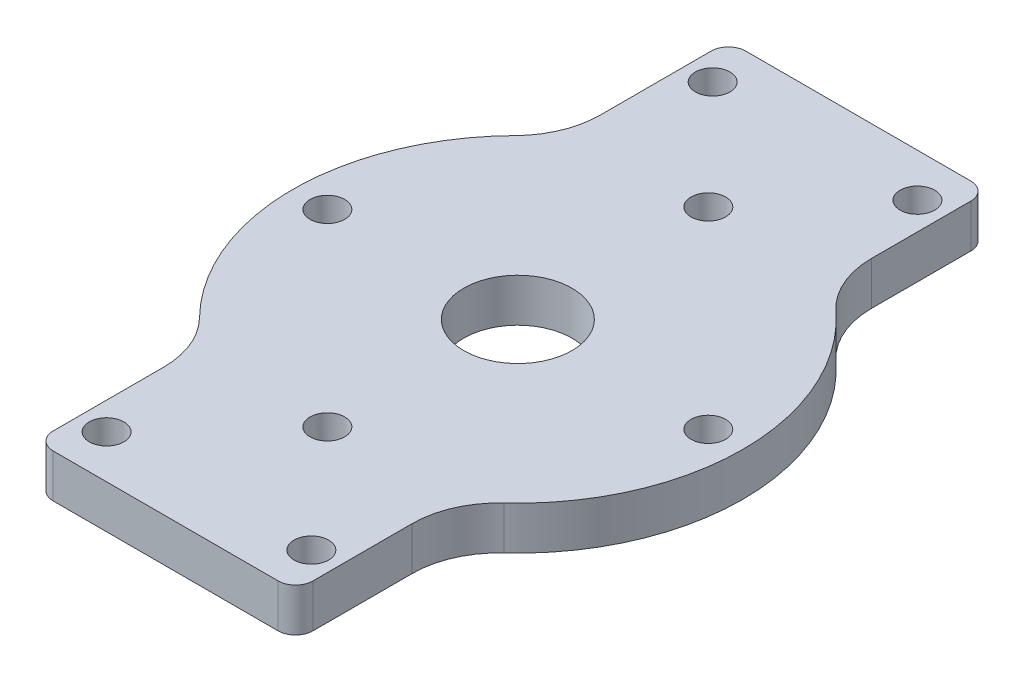
ISO-10303-21;
HEADER;
FILE_DESCRIPTION(('STEP AP214'),'2;1');
FILE_NAME('part.step','',(''),(''),'','','');
FILE_SCHEMA(('AUTOMOTIVE_DESIGN { 1 0 10303 214 1 1 1 1 }'));
ENDSEC;
DATA;
#1=APPLICATION_CONTEXT('core data for automotive mechanical design processes');
#2=APPLICATION_PROTOCOL_DEFINITION('international standard','automotive_design',2000,#1);
#3=PRODUCT_CONTEXT('',#1,'mechanical');
#4=PRODUCT('Part','Part','',(#3));
#5=PRODUCT_RELATED_PRODUCT_CATEGORY('part','',(#4));
#6=PRODUCT_DEFINITION_FORMATION('','',#4);
#7=PRODUCT_DEFINITION_CONTEXT('part definition',#1,'design');
#8=PRODUCT_DEFINITION('design','',#6,#7);
#9=PRODUCT_DEFINITION_SHAPE('','',#8);
#10=(LENGTH_UNIT() NAMED_UNIT(*) SI_UNIT(.MILLI.,.METRE.));
#11=(NAMED_UNIT(*) PLANE_ANGLE_UNIT() SI_UNIT($,.RADIAN.));
#12=(NAMED_UNIT(*) SI_UNIT($,.STERADIAN.) SOLID_ANGLE_UNIT());
#13=UNCERTAINTY_MEASURE_WITH_UNIT(LENGTH_MEASURE(1.E-05),#10,'distance_accuracy_value','');
#14=(GEOMETRIC_REPRESENTATION_CONTEXT(3) GLOBAL_UNCERTAINTY_ASSIGNED_CONTEXT((#13)) GLOBAL_UNIT_ASSIGNED_CONTEXT((#10,
#11,#12)) REPRESENTATION_CONTEXT('',''));
#15=CARTESIAN_POINT('',(0.,0.,0.));
#16=DIRECTION('',(0.,0.,1.));
#17=DIRECTION('',(1.,0.,0.));
#18=AXIS2_PLACEMENT_3D('',#15,#16,#17);
#19=CARTESIAN_POINT('',(-25.6756756756757,2.5,25.2340975387969));
#20=DIRECTION('',(0.,-1.,0.));
#21=DIRECTION('',(0.,0.,-1.));
#22=AXIS2_PLACEMENT_3D('',#19,#20,#21);
#23=CYLINDRICAL_SURFACE('',#22,10.);
#24=CARTESIAN_POINT('',(-25.6756756756757,-2.5,25.2340975387969));
#25=DIRECTION('',(0.,-1.,0.));
#26=DIRECTION('',(0.,0.,1.));
#27=AXIS2_PLACEMENT_3D('',#24,#25,#26);
#28=CIRCLE('',#27,10.);
#29=CARTESIAN_POINT('',(-18.5435435435435,-2.5,18.2246260002422));
#30=VERTEX_POINT('',#29);
#31=CARTESIAN_POINT('',(-15.6756756756757,-2.5,25.2340975387969));
#32=VERTEX_POINT('',#31);
#33=EDGE_CURVE('E181',#30,#32,#28,.T.);
#34=ORIENTED_EDGE('',*,*,#33,.T.);
#35=DIRECTION('',(0.,-1.,0.));
#36=VECTOR('',#35,1.);
#37=CARTESIAN_POINT('',(-15.6756756756757,2.5,25.2340975387969));
#38=LINE('',#37,#36);
#39=CARTESIAN_POINT('',(-15.6756756756757,2.5,25.2340975387969));
#40=VERTEX_POINT('',#39);
#41=EDGE_CURVE('E161',#40,#32,#38,.T.);
#42=ORIENTED_EDGE('',*,*,#41,.F.);
#43=CARTESIAN_POINT('',(-25.6756756756757,2.5,25.2340975387969));
#44=DIRECTION('',(0.,-1.,0.));
#45=DIRECTION('',(0.,0.,1.));
#46=AXIS2_PLACEMENT_3D('',#43,#44,#45);
#47=CIRCLE('',#46,10.);
#48=CARTESIAN_POINT('',(-18.5435435435435,2.5,18.2246260002422));
#49=VERTEX_POINT('',#48);
#50=EDGE_CURVE('E167',#49,#40,#47,.T.);
#51=ORIENTED_EDGE('',*,*,#50,.F.);
#52=DIRECTION('',(0.,-1.,0.));
#53=VECTOR('',#52,1.);
#54=CARTESIAN_POINT('',(-18.5435435435435,2.5,18.2246260002422));
#55=LINE('',#54,#53);
#56=EDGE_CURVE('E334',#49,#30,#55,.T.);
#57=ORIENTED_EDGE('',*,*,#56,.T.);
#58=EDGE_LOOP('',(#34,#42,#51,#57));
#59=FACE_BOUND('',#58,.T.);
#60=ADVANCED_FACE('F41',(#59),#23,.F.);
#61=CARTESIAN_POINT('',(-15.6756756756757,2.5,25.2340975387969));
#62=DIRECTION('',(1.,0.,0.));
#63=DIRECTION('',(0.,0.,-1.));
#64=AXIS2_PLACEMENT_3D('',#61,#62,#63);
#65=PLANE('',#64);
#66=DIRECTION('',(0.,0.,1.));
#67=VECTOR('',#66,1.);
#68=CARTESIAN_POINT('',(-15.6756756756757,-2.5,25.2340975387969));
#69=LINE('',#68,#67);
#70=CARTESIAN_POINT('',(-15.6756756756757,-2.5,38.));
#71=VERTEX_POINT('',#70);
#72=EDGE_CURVE('E309',#32,#71,#69,.T.);
#73=ORIENTED_EDGE('',*,*,#72,.T.);
#74=DIRECTION('',(0.,-1.,0.));
#75=VECTOR('',#74,1.);
#76=CARTESIAN_POINT('',(-15.6756756756757,2.5,38.));
#77=LINE('',#76,#75);
#78=CARTESIAN_POINT('',(-15.6756756756757,2.5,38.));
#79=VERTEX_POINT('',#78);
#80=EDGE_CURVE('E50',#71,#79,#77,.F.);
#81=ORIENTED_EDGE('',*,*,#80,.T.);
#82=DIRECTION('',(0.,0.,1.));
#83=VECTOR('',#82,1.);
#84=CARTESIAN_POINT('',(-15.6756756756757,2.5,25.2340975387969));
#85=LINE('',#84,#83);
#86=EDGE_CURVE('E156',#40,#79,#85,.T.);
#87=ORIENTED_EDGE('',*,*,#86,.F.);
#88=ORIENTED_EDGE('',*,*,#41,.T.);
#89=EDGE_LOOP('',(#73,#81,#87,#88));
#90=FACE_BOUND('',#89,.T.);
#91=ADVANCED_FACE('F159',(#90),#65,.F.);
#92=CARTESIAN_POINT('',(-15.6756756756757,2.5,40.));
#93=DIRECTION('',(0.,0.,-1.));
#94=DIRECTION('',(-1.,0.,0.));
#95=AXIS2_PLACEMENT_3D('',#92,#93,#94);
#96=PLANE('',#95);
#97=DIRECTION('',(1.,0.,0.));
#98=VECTOR('',#97,1.);
#99=CARTESIAN_POINT('',(-15.6756756756757,-2.5,40.));
#100=LINE('',#99,#98);
#101=CARTESIAN_POINT('',(-13.6756756756757,-2.5,40.));
#102=VERTEX_POINT('',#101);
#103=CARTESIAN_POINT('',(12.3243243243243,-2.5,40.));
#104=VERTEX_POINT('',#103);
#105=EDGE_CURVE('E285',#102,#104,#100,.T.);
#106=ORIENTED_EDGE('',*,*,#105,.T.);
#107=DIRECTION('',(0.,-1.,0.));
#108=VECTOR('',#107,1.);
#109=CARTESIAN_POINT('',(12.3243243243243,2.5,40.));
#110=LINE('',#109,#108);
#111=CARTESIAN_POINT('',(12.3243243243243,2.5,40.));
#112=VERTEX_POINT('',#111);
#113=EDGE_CURVE('E275',#104,#112,#110,.F.);
#114=ORIENTED_EDGE('',*,*,#113,.T.);
#115=DIRECTION('',(1.,0.,0.));
#116=VECTOR('',#115,1.);
#117=CARTESIAN_POINT('',(-15.6756756756757,2.5,40.));
#118=LINE('',#117,#116);
#119=CARTESIAN_POINT('',(-13.6756756756757,2.5,40.));
#120=VERTEX_POINT('',#119);
#121=EDGE_CURVE('E166',#120,#112,#118,.T.);
#122=ORIENTED_EDGE('',*,*,#121,.F.);
#123=DIRECTION('',(0.,-1.,0.));
#124=VECTOR('',#123,1.);
#125=CARTESIAN_POINT('',(-13.6756756756757,2.5,40.));
#126=LINE('',#125,#124);
#127=EDGE_CURVE('E271',#120,#102,#126,.T.);
#128=ORIENTED_EDGE('',*,*,#127,.T.);
#129=EDGE_LOOP('',(#106,#114,#122,#128));
#130=FACE_BOUND('',#129,.T.);
#131=ADVANCED_FACE('F282',(#130),#96,.F.);
#132=CARTESIAN_POINT('',(14.3243243243243,2.5,26.5391643833238));
#133=DIRECTION('',(-1.,0.,0.));
#134=DIRECTION('',(0.,0.,1.));
#135=AXIS2_PLACEMENT_3D('',#132,#133,#134);
#136=PLANE('',#135);
#137=DIRECTION('',(0.,0.,-1.));
#138=VECTOR('',#137,1.);
#139=CARTESIAN_POINT('',(14.3243243243243,2.5,26.5391643833238));
#140=LINE('',#139,#138);
#141=CARTESIAN_POINT('',(14.3243243243243,2.5,38.));
#142=VERTEX_POINT('',#141);
#143=CARTESIAN_POINT('',(14.3243243243243,2.5,26.5391643833238));
#144=VERTEX_POINT('',#143);
#145=EDGE_CURVE('E288',#142,#144,#140,.T.);
#146=ORIENTED_EDGE('',*,*,#145,.F.);
#147=DIRECTION('',(0.,-1.,0.));
#148=VECTOR('',#147,1.);
#149=CARTESIAN_POINT('',(14.3243243243243,2.5,38.));
#150=LINE('',#149,#148);
#151=CARTESIAN_POINT('',(14.3243243243243,-2.5,38.));
#152=VERTEX_POINT('',#151);
#153=EDGE_CURVE('E267',#142,#152,#150,.T.);
#154=ORIENTED_EDGE('',*,*,#153,.T.);
#155=DIRECTION('',(0.,0.,-1.));
#156=VECTOR('',#155,1.);
#157=CARTESIAN_POINT('',(14.3243243243243,-2.5,26.5391643833238));
#158=LINE('',#157,#156);
#159=CARTESIAN_POINT('',(14.3243243243243,-2.5,26.5391643833238));
#160=VERTEX_POINT('',#159);
#161=EDGE_CURVE('E296',#152,#160,#158,.T.);
#162=ORIENTED_EDGE('',*,*,#161,.T.);
#163=DIRECTION('',(0.,-1.,0.));
#164=VECTOR('',#163,1.);
#165=CARTESIAN_POINT('',(14.3243243243243,2.5,26.5391643833238));
#166=LINE('',#165,#164);
#167=EDGE_CURVE('E184',#144,#160,#166,.T.);
#168=ORIENTED_EDGE('',*,*,#167,.F.);
#169=EDGE_LOOP('',(#146,#154,#162,#168));
#170=FACE_BOUND('',#169,.T.);
#171=ADVANCED_FACE('F294',(#170),#136,.F.);
#172=CARTESIAN_POINT('',(24.3243243243243,2.5,26.5391643833238));
#173=DIRECTION('',(0.,-1.,0.));
#174=DIRECTION('',(0.,0.,-1.));
#175=AXIS2_PLACEMENT_3D('',#172,#173,#174);
#176=CYLINDRICAL_SURFACE('',#175,10.);
#177=CARTESIAN_POINT('',(24.3243243243243,-2.5,26.5391643833238));
#178=DIRECTION('',(0.,-1.,0.));
#179=DIRECTION('',(0.,0.,-1.));
#180=AXIS2_PLACEMENT_3D('',#177,#178,#179);
#181=CIRCLE('',#180,10.);
#182=CARTESIAN_POINT('',(17.5675675675676,-2.5,19.167174276845));
#183=VERTEX_POINT('',#182);
#184=EDGE_CURVE('E302',#160,#183,#181,.T.);
#185=ORIENTED_EDGE('',*,*,#184,.T.);
#186=DIRECTION('',(0.,-1.,0.));
#187=VECTOR('',#186,1.);
#188=CARTESIAN_POINT('',(17.5675675675676,2.5,19.167174276845));
#189=LINE('',#188,#187);
#190=CARTESIAN_POINT('',(17.5675675675676,2.5,19.167174276845));
#191=VERTEX_POINT('',#190);
#192=EDGE_CURVE('E191',#191,#183,#189,.T.);
#193=ORIENTED_EDGE('',*,*,#192,.F.);
#194=CARTESIAN_POINT('',(24.3243243243243,2.5,26.5391643833238));
#195=DIRECTION('',(0.,-1.,0.));
#196=DIRECTION('',(0.,0.,-1.));
#197=AXIS2_PLACEMENT_3D('',#194,#195,#196);
#198=CIRCLE('',#197,10.);
#199=EDGE_CURVE('E711',#144,#191,#198,.T.);
#200=ORIENTED_EDGE('',*,*,#199,.F.);
#201=ORIENTED_EDGE('',*,*,#167,.T.);
#202=EDGE_LOOP('',(#185,#193,#200,#201));
#203=FACE_BOUND('',#202,.T.);
#204=ADVANCED_FACE('F460',(#203),#176,.F.);
#205=CARTESIAN_POINT('',(0.,2.5,0.));
#206=DIRECTION('',(0.,-1.,0.));
#207=DIRECTION('',(0.,0.,-1.));
#208=AXIS2_PLACEMENT_3D('',#205,#206,#207);
#209=CYLINDRICAL_SURFACE('',#208,26.);
#210=CARTESIAN_POINT('',(0.,-2.5,0.));
#211=DIRECTION('',(0.,1.,0.));
#212=DIRECTION('',(0.,0.,1.));
#213=AXIS2_PLACEMENT_3D('',#210,#211,#212);
#214=CIRCLE('',#213,26.);
#215=CARTESIAN_POINT('',(17.5675675675676,-2.5,-19.167174276845));
#216=VERTEX_POINT('',#215);
#217=EDGE_CURVE('E307',#183,#216,#214,.T.);
#218=ORIENTED_EDGE('',*,*,#217,.T.);
#219=DIRECTION('',(0.,-1.,0.));
#220=VECTOR('',#219,1.);
#221=CARTESIAN_POINT('',(17.5675675675676,2.5,-19.167174276845));
#222=LINE('',#221,#220);
#223=CARTESIAN_POINT('',(17.5675675675676,2.5,-19.167174276845));
#224=VERTEX_POINT('',#223);
#225=EDGE_CURVE('E349',#224,#216,#222,.T.);
#226=ORIENTED_EDGE('',*,*,#225,.F.);
#227=CARTESIAN_POINT('',(0.,2.5,0.));
#228=DIRECTION('',(0.,1.,0.));
#229=DIRECTION('',(0.,0.,1.));
#230=AXIS2_PLACEMENT_3D('',#227,#228,#229);
#231=CIRCLE('',#230,26.);
#232=EDGE_CURVE('E359',#191,#224,#231,.T.);
#233=ORIENTED_EDGE('',*,*,#232,.F.);
#234=ORIENTED_EDGE('',*,*,#192,.T.);
#235=EDGE_LOOP('',(#218,#226,#233,#234));
#236=FACE_BOUND('',#235,.T.);
#237=ADVANCED_FACE('F357',(#236),#209,.T.);
#238=CARTESIAN_POINT('',(24.3243243243243,2.5,-26.5391643833238));
#239=DIRECTION('',(0.,-1.,0.));
#240=DIRECTION('',(0.,0.,-1.));
#241=AXIS2_PLACEMENT_3D('',#238,#239,#240);
#242=CYLINDRICAL_SURFACE('',#241,10.);
#243=CARTESIAN_POINT('',(24.3243243243243,-2.5,-26.5391643833238));
#244=DIRECTION('',(0.,-1.,0.));
#245=DIRECTION('',(0.,0.,1.));
#246=AXIS2_PLACEMENT_3D('',#243,#244,#245);
#247=CIRCLE('',#246,10.);
#248=CARTESIAN_POINT('',(14.3243243243243,-2.5,-26.5391643833238));
#249=VERTEX_POINT('',#248);
#250=EDGE_CURVE('E315',#216,#249,#247,.T.);
#251=ORIENTED_EDGE('',*,*,#250,.T.);
#252=DIRECTION('',(0.,-1.,0.));
#253=VECTOR('',#252,1.);
#254=CARTESIAN_POINT('',(14.3243243243243,2.5,-26.5391643833238));
#255=LINE('',#254,#253);
#256=CARTESIAN_POINT('',(14.3243243243243,2.5,-26.5391643833238));
#257=VERTEX_POINT('',#256);
#258=EDGE_CURVE('E345',#257,#249,#255,.T.);
#259=ORIENTED_EDGE('',*,*,#258,.F.);
#260=CARTESIAN_POINT('',(24.3243243243243,2.5,-26.5391643833238));
#261=DIRECTION('',(0.,-1.,0.));
#262=DIRECTION('',(0.,0.,1.));
#263=AXIS2_PLACEMENT_3D('',#260,#261,#262);
#264=CIRCLE('',#263,10.);
#265=EDGE_CURVE('E376',#224,#257,#264,.T.);
#266=ORIENTED_EDGE('',*,*,#265,.F.);
#267=ORIENTED_EDGE('',*,*,#225,.T.);
#268=EDGE_LOOP('',(#251,#259,#266,#267));
#269=FACE_BOUND('',#268,.T.);
#270=ADVANCED_FACE('F366',(#269),#242,.F.);
#271=CARTESIAN_POINT('',(14.3243243243243,2.5,-40.));
#272=DIRECTION('',(-1.,0.,0.));
#273=DIRECTION('',(0.,0.,1.));
#274=AXIS2_PLACEMENT_3D('',#271,#272,#273);
#275=PLANE('',#274);
#276=DIRECTION('',(0.,0.,-1.));
#277=VECTOR('',#276,1.);
#278=CARTESIAN_POINT('',(14.3243243243243,-2.5,-40.));
#279=LINE('',#278,#277);
#280=CARTESIAN_POINT('',(14.3243243243243,-2.5,-38.));
#281=VERTEX_POINT('',#280);
#282=EDGE_CURVE('E318',#249,#281,#279,.T.);
#283=ORIENTED_EDGE('',*,*,#282,.T.);
#284=DIRECTION('',(0.,-1.,0.));
#285=VECTOR('',#284,1.);
#286=CARTESIAN_POINT('',(14.3243243243243,2.5,-38.));
#287=LINE('',#286,#285);
#288=CARTESIAN_POINT('',(14.3243243243243,2.5,-38.));
#289=VERTEX_POINT('',#288);
#290=EDGE_CURVE('E254',#281,#289,#287,.F.);
#291=ORIENTED_EDGE('',*,*,#290,.T.);
#292=DIRECTION('',(0.,0.,-1.));
#293=VECTOR('',#292,1.);
#294=CARTESIAN_POINT('',(14.3243243243243,2.5,-40.));
#295=LINE('',#294,#293);
#296=EDGE_CURVE('E372',#257,#289,#295,.T.);
#297=ORIENTED_EDGE('',*,*,#296,.F.);
#298=ORIENTED_EDGE('',*,*,#258,.T.);
#299=EDGE_LOOP('',(#283,#291,#297,#298));
#300=FACE_BOUND('',#299,.T.);
#301=ADVANCED_FACE('F370',(#300),#275,.F.);
#302=CARTESIAN_POINT('',(-15.6756756756757,2.5,-40.));
#303=DIRECTION('',(0.,0.,1.));
#304=DIRECTION('',(1.,0.,0.));
#305=AXIS2_PLACEMENT_3D('',#302,#303,#304);
#306=PLANE('',#305);
#307=DIRECTION('',(-1.,0.,0.));
#308=VECTOR('',#307,1.);
#309=CARTESIAN_POINT('',(-15.6756756756757,2.5,-40.));
#310=LINE('',#309,#308);
#311=CARTESIAN_POINT('',(12.3243243243243,2.5,-40.));
#312=VERTEX_POINT('',#311);
#313=CARTESIAN_POINT('',(-13.6756756756757,2.5,-40.));
#314=VERTEX_POINT('',#313);
#315=EDGE_CURVE('E375',#312,#314,#310,.T.);
#316=ORIENTED_EDGE('',*,*,#315,.F.);
#317=DIRECTION('',(0.,-1.,0.));
#318=VECTOR('',#317,1.);
#319=CARTESIAN_POINT('',(12.3243243243243,2.5,-40.));
#320=LINE('',#319,#318);
#321=CARTESIAN_POINT('',(12.3243243243243,-2.5,-40.));
#322=VERTEX_POINT('',#321);
#323=EDGE_CURVE('E188',#312,#322,#320,.T.);
#324=ORIENTED_EDGE('',*,*,#323,.T.);
#325=DIRECTION('',(-1.,0.,0.));
#326=VECTOR('',#325,1.);
#327=CARTESIAN_POINT('',(-15.6756756756757,-2.5,-40.));
#328=LINE('',#327,#326);
#329=CARTESIAN_POINT('',(-13.6756756756757,-2.5,-40.));
#330=VERTEX_POINT('',#329);
#331=EDGE_CURVE('E322',#322,#330,#328,.T.);
#332=ORIENTED_EDGE('',*,*,#331,.T.);
#333=DIRECTION('',(0.,-1.,0.));
#334=VECTOR('',#333,1.);
#335=CARTESIAN_POINT('',(-13.6756756756757,2.5,-40.));
#336=LINE('',#335,#334);
#337=EDGE_CURVE('E183',#330,#314,#336,.F.);
#338=ORIENTED_EDGE('',*,*,#337,.T.);
#339=EDGE_LOOP('',(#316,#324,#332,#338));
#340=FACE_BOUND('',#339,.T.);
#341=ADVANCED_FACE('F424',(#340),#306,.F.);
#342=CARTESIAN_POINT('',(-15.6756756756757,2.5,-40.));
#343=DIRECTION('',(1.,0.,0.));
#344=DIRECTION('',(0.,0.,-1.));
#345=AXIS2_PLACEMENT_3D('',#342,#343,#344);
#346=PLANE('',#345);
#347=DIRECTION('',(0.,0.,1.));
#348=VECTOR('',#347,1.);
#349=CARTESIAN_POINT('',(-15.6756756756757,2.5,-40.));
#350=LINE('',#349,#348);
#351=CARTESIAN_POINT('',(-15.6756756756757,2.5,-38.));
#352=VERTEX_POINT('',#351);
#353=CARTESIAN_POINT('',(-15.6756756756757,2.5,-25.2340975387969));
#354=VERTEX_POINT('',#353);
#355=EDGE_CURVE('E380',#352,#354,#350,.T.);
#356=ORIENTED_EDGE('',*,*,#355,.F.);
#357=DIRECTION('',(0.,-1.,0.));
#358=VECTOR('',#357,1.);
#359=CARTESIAN_POINT('',(-15.6756756756757,2.5,-38.));
#360=LINE('',#359,#358);
#361=CARTESIAN_POINT('',(-15.6756756756757,-2.5,-38.));
#362=VERTEX_POINT('',#361);
#363=EDGE_CURVE('E11',#352,#362,#360,.T.);
#364=ORIENTED_EDGE('',*,*,#363,.T.);
#365=DIRECTION('',(0.,0.,1.));
#366=VECTOR('',#365,1.);
#367=CARTESIAN_POINT('',(-15.6756756756757,-2.5,-40.));
#368=LINE('',#367,#366);
#369=CARTESIAN_POINT('',(-15.6756756756757,-2.5,-25.2340975387969));
#370=VERTEX_POINT('',#369);
#371=EDGE_CURVE('E326',#362,#370,#368,.T.);
#372=ORIENTED_EDGE('',*,*,#371,.T.);
#373=DIRECTION('',(0.,-1.,0.));
#374=VECTOR('',#373,1.);
#375=CARTESIAN_POINT('',(-15.6756756756757,2.5,-25.2340975387969));
#376=LINE('',#375,#374);
#377=EDGE_CURVE('E341',#354,#370,#376,.T.);
#378=ORIENTED_EDGE('',*,*,#377,.F.);
#379=EDGE_LOOP('',(#356,#364,#372,#378));
#380=FACE_BOUND('',#379,.T.);
#381=ADVANCED_FACE('F429',(#380),#346,.F.);
#382=CARTESIAN_POINT('',(-25.6756756756757,2.5,-25.2340975387969));
#383=DIRECTION('',(0.,-1.,0.));
#384=DIRECTION('',(0.,0.,-1.));
#385=AXIS2_PLACEMENT_3D('',#382,#383,#384);
#386=CYLINDRICAL_SURFACE('',#385,10.);
#387=CARTESIAN_POINT('',(-25.6756756756757,-2.5,-25.2340975387969));
#388=DIRECTION('',(0.,-1.,0.));
#389=DIRECTION('',(0.,0.,-1.));
#390=AXIS2_PLACEMENT_3D('',#387,#388,#389);
#391=CIRCLE('',#390,10.);
#392=CARTESIAN_POINT('',(-18.5435435435435,-2.5,-18.2246260002422));
#393=VERTEX_POINT('',#392);
#394=EDGE_CURVE('E329',#370,#393,#391,.T.);
#395=ORIENTED_EDGE('',*,*,#394,.T.);
#396=DIRECTION('',(0.,-1.,0.));
#397=VECTOR('',#396,1.);
#398=CARTESIAN_POINT('',(-18.5435435435435,2.5,-18.2246260002422));
#399=LINE('',#398,#397);
#400=CARTESIAN_POINT('',(-18.5435435435435,2.5,-18.2246260002422));
#401=VERTEX_POINT('',#400);
#402=EDGE_CURVE('E337',#401,#393,#399,.T.);
#403=ORIENTED_EDGE('',*,*,#402,.F.);
#404=CARTESIAN_POINT('',(-25.6756756756757,2.5,-25.2340975387969));
#405=DIRECTION('',(0.,-1.,0.));
#406=DIRECTION('',(0.,0.,-1.));
#407=AXIS2_PLACEMENT_3D('',#404,#405,#406);
#408=CIRCLE('',#407,10.);
#409=EDGE_CURVE('E387',#354,#401,#408,.T.);
#410=ORIENTED_EDGE('',*,*,#409,.F.);
#411=ORIENTED_EDGE('',*,*,#377,.T.);
#412=EDGE_LOOP('',(#395,#403,#410,#411));
#413=FACE_BOUND('',#412,.T.);
#414=ADVANCED_FACE('F435',(#413),#386,.F.);
#415=CARTESIAN_POINT('',(0.,2.5,0.));
#416=DIRECTION('',(0.,-1.,0.));
#417=DIRECTION('',(0.,0.,-1.));
#418=AXIS2_PLACEMENT_3D('',#415,#416,#417);
#419=CYLINDRICAL_SURFACE('',#418,26.);
#420=CARTESIAN_POINT('',(0.,-2.5,0.));
#421=DIRECTION('',(0.,1.,0.));
#422=DIRECTION('',(0.,0.,1.));
#423=AXIS2_PLACEMENT_3D('',#420,#421,#422);
#424=CIRCLE('',#423,26.);
#425=EDGE_CURVE('E178',#393,#30,#424,.T.);
#426=ORIENTED_EDGE('',*,*,#425,.T.);
#427=ORIENTED_EDGE('',*,*,#56,.F.);
#428=CARTESIAN_POINT('',(0.,2.5,0.));
#429=DIRECTION('',(0.,1.,0.));
#430=DIRECTION('',(0.,0.,1.));
#431=AXIS2_PLACEMENT_3D('',#428,#429,#430);
#432=CIRCLE('',#431,26.);
#433=EDGE_CURVE('E173',#401,#49,#432,.T.);
#434=ORIENTED_EDGE('',*,*,#433,.F.);
#435=ORIENTED_EDGE('',*,*,#402,.T.);
#436=EDGE_LOOP('',(#426,#427,#434,#435));
#437=FACE_BOUND('',#436,.T.);
#438=ADVANCED_FACE('F438',(#437),#419,.T.);
#439=CARTESIAN_POINT('',(-25.6756756756757,2.5,25.2340975387969));
#440=DIRECTION('',(0.,1.,0.));
#441=DIRECTION('',(0.,0.,1.));
#442=AXIS2_PLACEMENT_3D('',#439,#440,#441);
#443=PLANE('',#442);
#444=CARTESIAN_POINT('',(-12.5,2.5,35.));
#445=DIRECTION('',(0.,-1.,0.));
#446=DIRECTION('',(0.,0.,-1.));
#447=AXIS2_PLACEMENT_3D('',#444,#445,#446);
#448=CIRCLE('',#447,2.);
#449=CARTESIAN_POINT('',(-12.5,2.5,33.));
#450=VERTEX_POINT('',#449);
#451=EDGE_CURVE('E234',#450,#450,#448,.T.);
#452=ORIENTED_EDGE('',*,*,#451,.T.);
#453=EDGE_LOOP('',(#452));
#454=FACE_BOUND('',#453,.T.);
#455=CARTESIAN_POINT('',(11.1486486486487,2.5,35.));
#456=DIRECTION('',(0.,-1.,0.));
#457=DIRECTION('',(0.,0.,-1.));
#458=AXIS2_PLACEMENT_3D('',#455,#456,#457);
#459=CIRCLE('',#458,2.);
#460=CARTESIAN_POINT('',(11.1486486486487,2.5,33.));
#461=VERTEX_POINT('',#460);
#462=EDGE_CURVE('E680',#461,#461,#459,.T.);
#463=ORIENTED_EDGE('',*,*,#462,.T.);
#464=EDGE_LOOP('',(#463));
#465=FACE_BOUND('',#464,.T.);
#466=CARTESIAN_POINT('',(-12.5,2.5,-35.));
#467=DIRECTION('',(0.,1.,0.));
#468=DIRECTION('',(0.,0.,1.));
#469=AXIS2_PLACEMENT_3D('',#466,#467,#468);
#470=CIRCLE('',#469,2.);
#471=CARTESIAN_POINT('',(-12.5,2.5,-33.));
#472=VERTEX_POINT('',#471);
#473=EDGE_CURVE('E225',#472,#472,#470,.T.);
#474=ORIENTED_EDGE('',*,*,#473,.F.);
#475=EDGE_LOOP('',(#474));
#476=FACE_BOUND('',#475,.T.);
#477=CARTESIAN_POINT('',(11.1486486486487,2.5,-35.));
#478=DIRECTION('',(0.,1.,0.));
#479=DIRECTION('',(0.,0.,1.));
#480=AXIS2_PLACEMENT_3D('',#477,#478,#479);
#481=CIRCLE('',#480,2.);
#482=CARTESIAN_POINT('',(11.1486486486487,2.5,-33.));
#483=VERTEX_POINT('',#482);
#484=EDGE_CURVE('E237',#483,#483,#481,.T.);
#485=ORIENTED_EDGE('',*,*,#484,.F.);
#486=EDGE_LOOP('',(#485));
#487=FACE_BOUND('',#486,.T.);
#488=CARTESIAN_POINT('',(0.,2.5,0.));
#489=DIRECTION('',(0.,1.,0.));
#490=DIRECTION('',(0.,0.,1.));
#491=AXIS2_PLACEMENT_3D('',#488,#489,#490);
#492=CIRCLE('',#491,6.25);
#493=CARTESIAN_POINT('',(0.,2.5,6.25));
#494=VERTEX_POINT('',#493);
#495=EDGE_CURVE('E219',#494,#494,#492,.T.);
#496=ORIENTED_EDGE('',*,*,#495,.F.);
#497=EDGE_LOOP('',(#496));
#498=FACE_BOUND('',#497,.T.);
#499=CARTESIAN_POINT('',(-0.246697988002975,2.5,21.7533020119969));
#500=DIRECTION('',(0.,1.,0.));
#501=DIRECTION('',(1.,0.,0.));
#502=AXIS2_PLACEMENT_3D('',#499,#500,#501);
#503=CIRCLE('',#502,2.);
#504=CARTESIAN_POINT('',(1.75330201199702,2.5,21.7533020119969));
#505=VERTEX_POINT('',#504);
#506=EDGE_CURVE('E209',#505,#505,#503,.T.);
#507=ORIENTED_EDGE('',*,*,#506,.F.);
#508=EDGE_LOOP('',(#507));
#509=FACE_BOUND('',#508,.T.);
#510=CARTESIAN_POINT('',(-0.246697988003129,2.5,-22.2466979880031));
#511=DIRECTION('',(0.,1.,0.));
#512=DIRECTION('',(1.,0.,0.));
#513=AXIS2_PLACEMENT_3D('',#510,#511,#512);
#514=CIRCLE('',#513,2.);
#515=CARTESIAN_POINT('',(1.75330201199687,2.5,-22.2466979880031));
#516=VERTEX_POINT('',#515);
#517=EDGE_CURVE('E218',#516,#516,#514,.T.);
#518=ORIENTED_EDGE('',*,*,#517,.F.);
#519=EDGE_LOOP('',(#518));
#520=FACE_BOUND('',#519,.T.);
#521=CARTESIAN_POINT('',(-22.,2.5,0.));
#522=DIRECTION('',(0.,1.,0.));
#523=DIRECTION('',(0.,0.,1.));
#524=AXIS2_PLACEMENT_3D('',#521,#522,#523);
#525=CIRCLE('',#524,2.);
#526=CARTESIAN_POINT('',(-22.,2.5,2.));
#527=VERTEX_POINT('',#526);
#528=EDGE_CURVE('E200',#527,#527,#525,.T.);
#529=ORIENTED_EDGE('',*,*,#528,.F.);
#530=EDGE_LOOP('',(#529));
#531=FACE_BOUND('',#530,.T.);
#532=CARTESIAN_POINT('',(22.,2.5,0.));
#533=DIRECTION('',(0.,1.,0.));
#534=DIRECTION('',(0.,0.,1.));
#535=AXIS2_PLACEMENT_3D('',#532,#533,#534);
#536=CIRCLE('',#535,2.);
#537=CARTESIAN_POINT('',(22.,2.5,2.));
#538=VERTEX_POINT('',#537);
#539=EDGE_CURVE('E213',#538,#538,#536,.T.);
#540=ORIENTED_EDGE('',*,*,#539,.F.);
#541=EDGE_LOOP('',(#540));
#542=FACE_BOUND('',#541,.T.);
#543=ORIENTED_EDGE('',*,*,#296,.T.);
#544=CARTESIAN_POINT('',(12.3243243243243,2.5,-38.));
#545=DIRECTION('',(0.,1.,0.));
#546=DIRECTION('',(0.,0.,1.));
#547=AXIS2_PLACEMENT_3D('',#544,#545,#546);
#548=CIRCLE('',#547,2.);
#549=EDGE_CURVE('E264',#289,#312,#548,.T.);
#550=ORIENTED_EDGE('',*,*,#549,.T.);
#551=ORIENTED_EDGE('',*,*,#315,.T.);
#552=CARTESIAN_POINT('',(-13.6756756756757,2.5,-38.));
#553=DIRECTION('',(0.,1.,0.));
#554=DIRECTION('',(0.,0.,1.));
#555=AXIS2_PLACEMENT_3D('',#552,#553,#554);
#556=CIRCLE('',#555,2.);
#557=EDGE_CURVE('E57',#314,#352,#556,.T.);
#558=ORIENTED_EDGE('',*,*,#557,.T.);
#559=ORIENTED_EDGE('',*,*,#355,.T.);
#560=ORIENTED_EDGE('',*,*,#409,.T.);
#561=ORIENTED_EDGE('',*,*,#433,.T.);
#562=ORIENTED_EDGE('',*,*,#50,.T.);
#563=ORIENTED_EDGE('',*,*,#86,.T.);
#564=CARTESIAN_POINT('',(-13.6756756756757,2.5,38.));
#565=DIRECTION('',(0.,1.,0.));
#566=DIRECTION('',(0.,0.,1.));
#567=AXIS2_PLACEMENT_3D('',#564,#565,#566);
#568=CIRCLE('',#567,2.);
#569=EDGE_CURVE('E259',#79,#120,#568,.T.);
#570=ORIENTED_EDGE('',*,*,#569,.T.);
#571=ORIENTED_EDGE('',*,*,#121,.T.);
#572=CARTESIAN_POINT('',(12.3243243243243,2.5,38.));
#573=DIRECTION('',(0.,1.,0.));
#574=DIRECTION('',(0.,0.,1.));
#575=AXIS2_PLACEMENT_3D('',#572,#573,#574);
#576=CIRCLE('',#575,2.);
#577=EDGE_CURVE('E64',#112,#142,#576,.T.);
#578=ORIENTED_EDGE('',*,*,#577,.T.);
#579=ORIENTED_EDGE('',*,*,#145,.T.);
#580=ORIENTED_EDGE('',*,*,#199,.T.);
#581=ORIENTED_EDGE('',*,*,#232,.T.);
#582=ORIENTED_EDGE('',*,*,#265,.T.);
#583=EDGE_LOOP('',(#543,#550,#551,#558,#559,#560,#561,#562,#563,#570,#571,#578,#579,#580,#581,#582));
#584=FACE_BOUND('',#583,.T.);
#585=ADVANCED_FACE('F171',(#454,#465,#476,#487,#498,#509,#520,#531,#542,#584),#443,.T.);
#586=CARTESIAN_POINT('',(-25.6756756756757,-2.5,25.2340975387969));
#587=DIRECTION('',(0.,1.,0.));
#588=DIRECTION('',(0.,0.,1.));
#589=AXIS2_PLACEMENT_3D('',#586,#587,#588);
#590=PLANE('',#589);
#591=CARTESIAN_POINT('',(-12.5,-2.5,35.));
#592=DIRECTION('',(0.,1.,0.));
#593=DIRECTION('',(0.,0.,1.));
#594=AXIS2_PLACEMENT_3D('',#591,#592,#593);
#595=CIRCLE('',#594,2.);
#596=CARTESIAN_POINT('',(-12.5,-2.5,37.));
#597=VERTEX_POINT('',#596);
#598=EDGE_CURVE('E233',#597,#597,#595,.F.);
#599=ORIENTED_EDGE('',*,*,#598,.F.);
#600=EDGE_LOOP('',(#599));
#601=FACE_BOUND('',#600,.T.);
#602=CARTESIAN_POINT('',(11.1486486486487,-2.5,35.));
#603=DIRECTION('',(0.,1.,0.));
#604=DIRECTION('',(0.,0.,1.));
#605=AXIS2_PLACEMENT_3D('',#602,#603,#604);
#606=CIRCLE('',#605,2.);
#607=CARTESIAN_POINT('',(11.1486486486487,-2.5,37.));
#608=VERTEX_POINT('',#607);
#609=EDGE_CURVE('E229',#608,#608,#606,.F.);
#610=ORIENTED_EDGE('',*,*,#609,.F.);
#611=EDGE_LOOP('',(#610));
#612=FACE_BOUND('',#611,.T.);
#613=CARTESIAN_POINT('',(-12.5,-2.5,-35.));
#614=DIRECTION('',(0.,1.,0.));
#615=DIRECTION('',(0.,0.,1.));
#616=AXIS2_PLACEMENT_3D('',#613,#614,#615);
#617=CIRCLE('',#616,2.);
#618=CARTESIAN_POINT('',(-12.5,-2.5,-33.));
#619=VERTEX_POINT('',#618);
#620=EDGE_CURVE('E224',#619,#619,#617,.T.);
#621=ORIENTED_EDGE('',*,*,#620,.T.);
#622=EDGE_LOOP('',(#621));
#623=FACE_BOUND('',#622,.T.);
#624=CARTESIAN_POINT('',(11.1486486486487,-2.5,-35.));
#625=DIRECTION('',(0.,1.,0.));
#626=DIRECTION('',(0.,0.,1.));
#627=AXIS2_PLACEMENT_3D('',#624,#625,#626);
#628=CIRCLE('',#627,2.);
#629=CARTESIAN_POINT('',(11.1486486486487,-2.5,-33.));
#630=VERTEX_POINT('',#629);
#631=EDGE_CURVE('E220',#630,#630,#628,.T.);
#632=ORIENTED_EDGE('',*,*,#631,.T.);
#633=EDGE_LOOP('',(#632));
#634=FACE_BOUND('',#633,.T.);
#635=CARTESIAN_POINT('',(0.,-2.5,0.));
#636=DIRECTION('',(0.,1.,0.));
#637=DIRECTION('',(0.,0.,1.));
#638=AXIS2_PLACEMENT_3D('',#635,#636,#637);
#639=CIRCLE('',#638,6.25);
#640=CARTESIAN_POINT('',(0.,-2.5,6.25));
#641=VERTEX_POINT('',#640);
#642=EDGE_CURVE('E214',#641,#641,#639,.T.);
#643=ORIENTED_EDGE('',*,*,#642,.T.);
#644=EDGE_LOOP('',(#643));
#645=FACE_BOUND('',#644,.T.);
#646=CARTESIAN_POINT('',(-0.246697988002975,-2.5,21.7533020119969));
#647=DIRECTION('',(0.,1.,0.));
#648=DIRECTION('',(0.,0.,1.));
#649=AXIS2_PLACEMENT_3D('',#646,#647,#648);
#650=CIRCLE('',#649,2.);
#651=CARTESIAN_POINT('',(-0.246697988002975,-2.5,23.7533020119969));
#652=VERTEX_POINT('',#651);
#653=EDGE_CURVE('E208',#652,#652,#650,.T.);
#654=ORIENTED_EDGE('',*,*,#653,.T.);
#655=EDGE_LOOP('',(#654));
#656=FACE_BOUND('',#655,.T.);
#657=CARTESIAN_POINT('',(-0.246697988003129,-2.5,-22.2466979880031));
#658=DIRECTION('',(0.,1.,0.));
#659=DIRECTION('',(0.,0.,1.));
#660=AXIS2_PLACEMENT_3D('',#657,#658,#659);
#661=CIRCLE('',#660,2.);
#662=CARTESIAN_POINT('',(-0.246697988003129,-2.5,-20.2466979880031));
#663=VERTEX_POINT('',#662);
#664=EDGE_CURVE('E204',#663,#663,#661,.T.);
#665=ORIENTED_EDGE('',*,*,#664,.T.);
#666=EDGE_LOOP('',(#665));
#667=FACE_BOUND('',#666,.T.);
#668=CARTESIAN_POINT('',(-22.,-2.5,0.));
#669=DIRECTION('',(0.,1.,0.));
#670=DIRECTION('',(0.,0.,1.));
#671=AXIS2_PLACEMENT_3D('',#668,#669,#670);
#672=CIRCLE('',#671,2.);
#673=CARTESIAN_POINT('',(-22.,-2.5,2.));
#674=VERTEX_POINT('',#673);
#675=EDGE_CURVE('E199',#674,#674,#672,.T.);
#676=ORIENTED_EDGE('',*,*,#675,.T.);
#677=EDGE_LOOP('',(#676));
#678=FACE_BOUND('',#677,.T.);
#679=CARTESIAN_POINT('',(22.,-2.5,0.));
#680=DIRECTION('',(0.,1.,0.));
#681=DIRECTION('',(0.,0.,1.));
#682=AXIS2_PLACEMENT_3D('',#679,#680,#681);
#683=CIRCLE('',#682,2.);
#684=CARTESIAN_POINT('',(22.,-2.5,2.));
#685=VERTEX_POINT('',#684);
#686=EDGE_CURVE('E195',#685,#685,#683,.T.);
#687=ORIENTED_EDGE('',*,*,#686,.T.);
#688=EDGE_LOOP('',(#687));
#689=FACE_BOUND('',#688,.T.);
#690=ORIENTED_EDGE('',*,*,#331,.F.);
#691=CARTESIAN_POINT('',(12.3243243243243,-2.5,-38.));
#692=DIRECTION('',(0.,1.,0.));
#693=DIRECTION('',(0.,0.,1.));
#694=AXIS2_PLACEMENT_3D('',#691,#692,#693);
#695=CIRCLE('',#694,2.);
#696=EDGE_CURVE('E251',#322,#281,#695,.F.);
#697=ORIENTED_EDGE('',*,*,#696,.T.);
#698=ORIENTED_EDGE('',*,*,#282,.F.);
#699=ORIENTED_EDGE('',*,*,#250,.F.);
#700=ORIENTED_EDGE('',*,*,#217,.F.);
#701=ORIENTED_EDGE('',*,*,#184,.F.);
#702=ORIENTED_EDGE('',*,*,#161,.F.);
#703=CARTESIAN_POINT('',(12.3243243243243,-2.5,38.));
#704=DIRECTION('',(0.,1.,0.));
#705=DIRECTION('',(0.,0.,1.));
#706=AXIS2_PLACEMENT_3D('',#703,#704,#705);
#707=CIRCLE('',#706,2.);
#708=EDGE_CURVE('E248',#152,#104,#707,.F.);
#709=ORIENTED_EDGE('',*,*,#708,.T.);
#710=ORIENTED_EDGE('',*,*,#105,.F.);
#711=CARTESIAN_POINT('',(-13.6756756756757,-2.5,38.));
#712=DIRECTION('',(0.,1.,0.));
#713=DIRECTION('',(0.,0.,1.));
#714=AXIS2_PLACEMENT_3D('',#711,#712,#713);
#715=CIRCLE('',#714,2.);
#716=EDGE_CURVE('E245',#102,#71,#715,.F.);
#717=ORIENTED_EDGE('',*,*,#716,.T.);
#718=ORIENTED_EDGE('',*,*,#72,.F.);
#719=ORIENTED_EDGE('',*,*,#33,.F.);
#720=ORIENTED_EDGE('',*,*,#425,.F.);
#721=ORIENTED_EDGE('',*,*,#394,.F.);
#722=ORIENTED_EDGE('',*,*,#371,.F.);
#723=CARTESIAN_POINT('',(-13.6756756756757,-2.5,-38.));
#724=DIRECTION('',(0.,1.,0.));
#725=DIRECTION('',(0.,0.,1.));
#726=AXIS2_PLACEMENT_3D('',#723,#724,#725);
#727=CIRCLE('',#726,2.);
#728=EDGE_CURVE('E242',#362,#330,#727,.F.);
#729=ORIENTED_EDGE('',*,*,#728,.T.);
#730=EDGE_LOOP('',(#690,#697,#698,#699,#700,#701,#702,#709,#710,#717,#718,#719,#720,#721,#722,#729));
#731=FACE_BOUND('',#730,.T.);
#732=ADVANCED_FACE('F300',(#601,#612,#623,#634,#645,#656,#667,#678,#689,#731),#590,.F.);
#733=CARTESIAN_POINT('',(22.,-24.5,0.));
#734=DIRECTION('',(0.,1.,0.));
#735=DIRECTION('',(0.,0.,1.));
#736=AXIS2_PLACEMENT_3D('',#733,#734,#735);
#737=CYLINDRICAL_SURFACE('',#736,2.);
#738=ORIENTED_EDGE('',*,*,#539,.T.);
#739=EDGE_LOOP('',(#738));
#740=FACE_BOUND('',#739,.T.);
#741=ORIENTED_EDGE('',*,*,#686,.F.);
#742=EDGE_LOOP('',(#741));
#743=FACE_BOUND('',#742,.T.);
#744=ADVANCED_FACE('F512',(#740,#743),#737,.F.);
#745=CARTESIAN_POINT('',(-22.,-24.5,0.));
#746=DIRECTION('',(0.,1.,0.));
#747=DIRECTION('',(0.,0.,1.));
#748=AXIS2_PLACEMENT_3D('',#745,#746,#747);
#749=CYLINDRICAL_SURFACE('',#748,2.);
#750=ORIENTED_EDGE('',*,*,#528,.T.);
#751=EDGE_LOOP('',(#750));
#752=FACE_BOUND('',#751,.T.);
#753=ORIENTED_EDGE('',*,*,#675,.F.);
#754=EDGE_LOOP('',(#753));
#755=FACE_BOUND('',#754,.T.);
#756=ADVANCED_FACE('F517',(#752,#755),#749,.F.);
#757=CARTESIAN_POINT('',(-0.246697988003129,-24.5,-22.2466979880031));
#758=DIRECTION('',(0.,1.,0.));
#759=DIRECTION('',(0.,0.,1.));
#760=AXIS2_PLACEMENT_3D('',#757,#758,#759);
#761=CYLINDRICAL_SURFACE('',#760,2.);
#762=ORIENTED_EDGE('',*,*,#517,.T.);
#763=EDGE_LOOP('',(#762));
#764=FACE_BOUND('',#763,.T.);
#765=ORIENTED_EDGE('',*,*,#664,.F.);
#766=EDGE_LOOP('',(#765));
#767=FACE_BOUND('',#766,.T.);
#768=ADVANCED_FACE('F529',(#764,#767),#761,.F.);
#769=CARTESIAN_POINT('',(-0.246697988002975,-24.5,21.7533020119969));
#770=DIRECTION('',(0.,1.,0.));
#771=DIRECTION('',(0.,0.,1.));
#772=AXIS2_PLACEMENT_3D('',#769,#770,#771);
#773=CYLINDRICAL_SURFACE('',#772,2.);
#774=ORIENTED_EDGE('',*,*,#506,.T.);
#775=EDGE_LOOP('',(#774));
#776=FACE_BOUND('',#775,.T.);
#777=ORIENTED_EDGE('',*,*,#653,.F.);
#778=EDGE_LOOP('',(#777));
#779=FACE_BOUND('',#778,.T.);
#780=ADVANCED_FACE('F539',(#776,#779),#773,.F.);
#781=CARTESIAN_POINT('',(0.,-24.5,0.));
#782=DIRECTION('',(0.,1.,0.));
#783=DIRECTION('',(0.,0.,1.));
#784=AXIS2_PLACEMENT_3D('',#781,#782,#783);
#785=CYLINDRICAL_SURFACE('',#784,6.25);
#786=ORIENTED_EDGE('',*,*,#495,.T.);
#787=EDGE_LOOP('',(#786));
#788=FACE_BOUND('',#787,.T.);
#789=ORIENTED_EDGE('',*,*,#642,.F.);
#790=EDGE_LOOP('',(#789));
#791=FACE_BOUND('',#790,.T.);
#792=ADVANCED_FACE('F549',(#788,#791),#785,.F.);
#793=CARTESIAN_POINT('',(11.1486486486487,-24.5,-35.));
#794=DIRECTION('',(0.,1.,0.));
#795=DIRECTION('',(0.,0.,1.));
#796=AXIS2_PLACEMENT_3D('',#793,#794,#795);
#797=CYLINDRICAL_SURFACE('',#796,2.);
#798=ORIENTED_EDGE('',*,*,#484,.T.);
#799=EDGE_LOOP('',(#798));
#800=FACE_BOUND('',#799,.T.);
#801=ORIENTED_EDGE('',*,*,#631,.F.);
#802=EDGE_LOOP('',(#801));
#803=FACE_BOUND('',#802,.T.);
#804=ADVANCED_FACE('F559',(#800,#803),#797,.F.);
#805=CARTESIAN_POINT('',(-12.5,-24.5,-35.));
#806=DIRECTION('',(0.,1.,0.));
#807=DIRECTION('',(0.,0.,1.));
#808=AXIS2_PLACEMENT_3D('',#805,#806,#807);
#809=CYLINDRICAL_SURFACE('',#808,2.);
#810=ORIENTED_EDGE('',*,*,#473,.T.);
#811=EDGE_LOOP('',(#810));
#812=FACE_BOUND('',#811,.T.);
#813=ORIENTED_EDGE('',*,*,#620,.F.);
#814=EDGE_LOOP('',(#813));
#815=FACE_BOUND('',#814,.T.);
#816=ADVANCED_FACE('F569',(#812,#815),#809,.F.);
#817=CARTESIAN_POINT('',(11.1486486486487,-24.5,35.));
#818=DIRECTION('',(0.,1.,0.));
#819=DIRECTION('',(0.,0.,1.));
#820=AXIS2_PLACEMENT_3D('',#817,#818,#819);
#821=CYLINDRICAL_SURFACE('',#820,2.);
#822=ORIENTED_EDGE('',*,*,#462,.F.);
#823=EDGE_LOOP('',(#822));
#824=FACE_BOUND('',#823,.T.);
#825=ORIENTED_EDGE('',*,*,#609,.T.);
#826=EDGE_LOOP('',(#825));
#827=FACE_BOUND('',#826,.T.);
#828=ADVANCED_FACE('F418',(#824,#827),#821,.F.);
#829=CARTESIAN_POINT('',(-12.5,-24.5,35.));
#830=DIRECTION('',(0.,1.,0.));
#831=DIRECTION('',(0.,0.,1.));
#832=AXIS2_PLACEMENT_3D('',#829,#830,#831);
#833=CYLINDRICAL_SURFACE('',#832,2.);
#834=ORIENTED_EDGE('',*,*,#451,.F.);
#835=EDGE_LOOP('',(#834));
#836=FACE_BOUND('',#835,.T.);
#837=ORIENTED_EDGE('',*,*,#598,.T.);
#838=EDGE_LOOP('',(#837));
#839=FACE_BOUND('',#838,.T.);
#840=ADVANCED_FACE('F413',(#836,#839),#833,.F.);
#841=CARTESIAN_POINT('',(12.3243243243243,2.5,-38.));
#842=DIRECTION('',(0.,-1.,0.));
#843=DIRECTION('',(0.,0.,-1.));
#844=AXIS2_PLACEMENT_3D('',#841,#842,#843);
#845=CYLINDRICAL_SURFACE('',#844,2.);
#846=ORIENTED_EDGE('',*,*,#549,.F.);
#847=ORIENTED_EDGE('',*,*,#290,.F.);
#848=ORIENTED_EDGE('',*,*,#696,.F.);
#849=ORIENTED_EDGE('',*,*,#323,.F.);
#850=EDGE_LOOP('',(#846,#847,#848,#849));
#851=FACE_BOUND('',#850,.T.);
#852=ADVANCED_FACE('F402',(#851),#845,.T.);
#853=CARTESIAN_POINT('',(12.3243243243243,2.5,38.));
#854=DIRECTION('',(0.,-1.,0.));
#855=DIRECTION('',(0.,0.,-1.));
#856=AXIS2_PLACEMENT_3D('',#853,#854,#855);
#857=CYLINDRICAL_SURFACE('',#856,2.);
#858=ORIENTED_EDGE('',*,*,#577,.F.);
#859=ORIENTED_EDGE('',*,*,#113,.F.);
#860=ORIENTED_EDGE('',*,*,#708,.F.);
#861=ORIENTED_EDGE('',*,*,#153,.F.);
#862=EDGE_LOOP('',(#858,#859,#860,#861));
#863=FACE_BOUND('',#862,.T.);
#864=ADVANCED_FACE('F291',(#863),#857,.T.);
#865=CARTESIAN_POINT('',(-13.6756756756757,2.5,38.));
#866=DIRECTION('',(0.,-1.,0.));
#867=DIRECTION('',(0.,0.,-1.));
#868=AXIS2_PLACEMENT_3D('',#865,#866,#867);
#869=CYLINDRICAL_SURFACE('',#868,2.);
#870=ORIENTED_EDGE('',*,*,#569,.F.);
#871=ORIENTED_EDGE('',*,*,#80,.F.);
#872=ORIENTED_EDGE('',*,*,#716,.F.);
#873=ORIENTED_EDGE('',*,*,#127,.F.);
#874=EDGE_LOOP('',(#870,#871,#872,#873));
#875=FACE_BOUND('',#874,.T.);
#876=ADVANCED_FACE('F395',(#875),#869,.T.);
#877=CARTESIAN_POINT('',(-13.6756756756757,2.5,-38.));
#878=DIRECTION('',(0.,-1.,0.));
#879=DIRECTION('',(0.,0.,-1.));
#880=AXIS2_PLACEMENT_3D('',#877,#878,#879);
#881=CYLINDRICAL_SURFACE('',#880,2.);
#882=ORIENTED_EDGE('',*,*,#557,.F.);
#883=ORIENTED_EDGE('',*,*,#337,.F.);
#884=ORIENTED_EDGE('',*,*,#728,.F.);
#885=ORIENTED_EDGE('',*,*,#363,.F.);
#886=EDGE_LOOP('',(#882,#883,#884,#885));
#887=FACE_BOUND('',#886,.T.);
#888=ADVANCED_FACE('F43',(#887),#881,.T.);
#889=CLOSED_SHELL('',(#60,#91,#131,#171,#204,#237,#270,#301,#341,#381,#414,#438,#585,#732,#744,
#756,#768,#780,#792,#804,#816,#828,#840,#852,#864,#876,#888));
#890=MANIFOLD_SOLID_BREP('B2',#889);
#891=ADVANCED_BREP_SHAPE_REPRESENTATION('',(#18,#890),#14);
#892=SHAPE_DEFINITION_REPRESENTATION(#9,#891);
ENDSEC;
END-ISO-10303-21;
